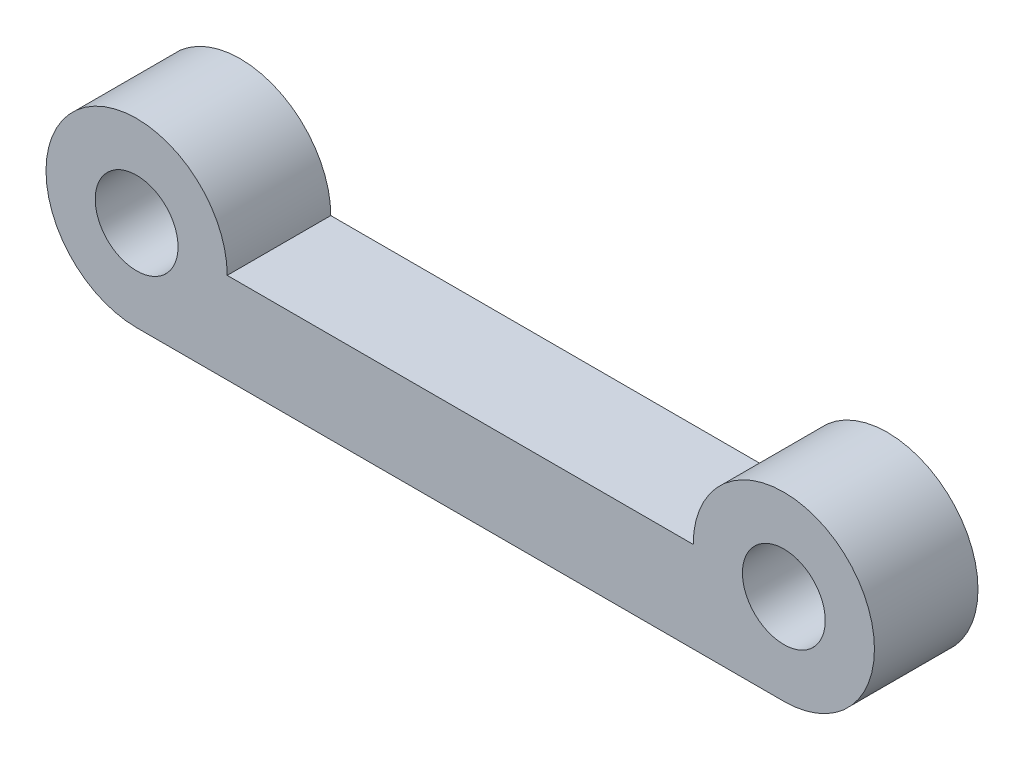
ISO-10303-21;
HEADER;
FILE_DESCRIPTION(('STEP AP214'),'2;1');
FILE_NAME('part.step','',(''),(''),'','','');
FILE_SCHEMA(('AUTOMOTIVE_DESIGN { 1 0 10303 214 1 1 1 1 }'));
ENDSEC;
DATA;
#1=APPLICATION_CONTEXT('core data for automotive mechanical design processes');
#2=APPLICATION_PROTOCOL_DEFINITION('international standard','automotive_design',2000,#1);
#3=PRODUCT_CONTEXT('',#1,'mechanical');
#4=PRODUCT('Part','Part','',(#3));
#5=PRODUCT_RELATED_PRODUCT_CATEGORY('part','',(#4));
#6=PRODUCT_DEFINITION_FORMATION('','',#4);
#7=PRODUCT_DEFINITION_CONTEXT('part definition',#1,'design');
#8=PRODUCT_DEFINITION('design','',#6,#7);
#9=PRODUCT_DEFINITION_SHAPE('','',#8);
#10=(LENGTH_UNIT() NAMED_UNIT(*) SI_UNIT(.MILLI.,.METRE.));
#11=(NAMED_UNIT(*) PLANE_ANGLE_UNIT() SI_UNIT($,.RADIAN.));
#12=(NAMED_UNIT(*) SI_UNIT($,.STERADIAN.) SOLID_ANGLE_UNIT());
#13=UNCERTAINTY_MEASURE_WITH_UNIT(LENGTH_MEASURE(1.E-05),#10,'distance_accuracy_value','');
#14=(GEOMETRIC_REPRESENTATION_CONTEXT(3) GLOBAL_UNCERTAINTY_ASSIGNED_CONTEXT((#13)) GLOBAL_UNIT_ASSIGNED_CONTEXT((#10,
#11,#12)) REPRESENTATION_CONTEXT('',''));
#15=CARTESIAN_POINT('',(0.,0.,0.));
#16=DIRECTION('',(0.,0.,1.));
#17=DIRECTION('',(1.,0.,0.));
#18=AXIS2_PLACEMENT_3D('',#15,#16,#17);
#19=CARTESIAN_POINT('',(0.,0.,4.));
#20=DIRECTION('',(0.,0.,1.));
#21=DIRECTION('',(1.,0.,0.));
#22=AXIS2_PLACEMENT_3D('',#19,#20,#21);
#23=PLANE('',#22);
#24=CARTESIAN_POINT('',(0.,0.,4.));
#25=DIRECTION('',(0.,0.,1.));
#26=DIRECTION('',(1.,0.,0.));
#27=AXIS2_PLACEMENT_3D('',#24,#25,#26);
#28=CIRCLE('',#27,1.6);
#29=CARTESIAN_POINT('',(1.6,0.,4.));
#30=VERTEX_POINT('',#29);
#31=EDGE_CURVE('E100',#30,#30,#28,.T.);
#32=ORIENTED_EDGE('',*,*,#31,.F.);
#33=EDGE_LOOP('',(#32));
#34=FACE_BOUND('',#33,.T.);
#35=CARTESIAN_POINT('',(0.,0.,4.));
#36=DIRECTION('',(0.,0.,1.));
#37=DIRECTION('',(1.,0.,0.));
#38=AXIS2_PLACEMENT_3D('',#35,#36,#37);
#39=CIRCLE('',#38,3.5);
#40=CARTESIAN_POINT('',(3.5,0.,4.));
#41=VERTEX_POINT('',#40);
#42=CARTESIAN_POINT('',(0.,-3.5,4.));
#43=VERTEX_POINT('',#42);
#44=EDGE_CURVE('E85',#41,#43,#39,.T.);
#45=ORIENTED_EDGE('',*,*,#44,.T.);
#46=DIRECTION('',(1.,0.,0.));
#47=VECTOR('',#46,1.);
#48=CARTESIAN_POINT('',(0.,-3.5,4.));
#49=LINE('',#48,#47);
#50=CARTESIAN_POINT('',(25.,-3.5,4.));
#51=VERTEX_POINT('',#50);
#52=EDGE_CURVE('E80',#43,#51,#49,.T.);
#53=ORIENTED_EDGE('',*,*,#52,.T.);
#54=CARTESIAN_POINT('',(25.,0.,4.));
#55=DIRECTION('',(0.,0.,1.));
#56=DIRECTION('',(1.,0.,0.));
#57=AXIS2_PLACEMENT_3D('',#54,#55,#56);
#58=CIRCLE('',#57,3.5);
#59=CARTESIAN_POINT('',(21.5,0.,4.));
#60=VERTEX_POINT('',#59);
#61=EDGE_CURVE('E83',#51,#60,#58,.T.);
#62=ORIENTED_EDGE('',*,*,#61,.T.);
#63=DIRECTION('',(-1.,0.,0.));
#64=VECTOR('',#63,1.);
#65=CARTESIAN_POINT('',(3.5,0.,4.));
#66=LINE('',#65,#64);
#67=EDGE_CURVE('E50',#60,#41,#66,.T.);
#68=ORIENTED_EDGE('',*,*,#67,.T.);
#69=EDGE_LOOP('',(#45,#53,#62,#68));
#70=FACE_BOUND('',#69,.T.);
#71=CARTESIAN_POINT('',(25.,0.,4.));
#72=DIRECTION('',(0.,0.,1.));
#73=DIRECTION('',(1.,0.,0.));
#74=AXIS2_PLACEMENT_3D('',#71,#72,#73);
#75=CIRCLE('',#74,1.6);
#76=CARTESIAN_POINT('',(26.6,0.,4.));
#77=VERTEX_POINT('',#76);
#78=EDGE_CURVE('E115',#77,#77,#75,.T.);
#79=ORIENTED_EDGE('',*,*,#78,.F.);
#80=EDGE_LOOP('',(#79));
#81=FACE_BOUND('',#80,.T.);
#82=ADVANCED_FACE('F33',(#34,#70,#81),#23,.T.);
#83=CARTESIAN_POINT('',(0.,0.,0.));
#84=DIRECTION('',(0.,0.,1.));
#85=DIRECTION('',(1.,0.,0.));
#86=AXIS2_PLACEMENT_3D('',#83,#84,#85);
#87=PLANE('',#86);
#88=CARTESIAN_POINT('',(0.,0.,0.));
#89=DIRECTION('',(0.,0.,1.));
#90=DIRECTION('',(1.,0.,0.));
#91=AXIS2_PLACEMENT_3D('',#88,#89,#90);
#92=CIRCLE('',#91,3.5);
#93=CARTESIAN_POINT('',(3.5,0.,0.));
#94=VERTEX_POINT('',#93);
#95=CARTESIAN_POINT('',(0.,-3.5,0.));
#96=VERTEX_POINT('',#95);
#97=EDGE_CURVE('E97',#94,#96,#92,.T.);
#98=ORIENTED_EDGE('',*,*,#97,.F.);
#99=DIRECTION('',(-1.,0.,0.));
#100=VECTOR('',#99,1.);
#101=CARTESIAN_POINT('',(3.5,0.,0.));
#102=LINE('',#101,#100);
#103=CARTESIAN_POINT('',(21.5,0.,0.));
#104=VERTEX_POINT('',#103);
#105=EDGE_CURVE('E73',#104,#94,#102,.T.);
#106=ORIENTED_EDGE('',*,*,#105,.F.);
#107=CARTESIAN_POINT('',(25.,0.,0.));
#108=DIRECTION('',(0.,0.,1.));
#109=DIRECTION('',(1.,0.,0.));
#110=AXIS2_PLACEMENT_3D('',#107,#108,#109);
#111=CIRCLE('',#110,3.5);
#112=CARTESIAN_POINT('',(25.,-3.5,0.));
#113=VERTEX_POINT('',#112);
#114=EDGE_CURVE('E67',#113,#104,#111,.T.);
#115=ORIENTED_EDGE('',*,*,#114,.F.);
#116=DIRECTION('',(1.,0.,0.));
#117=VECTOR('',#116,1.);
#118=CARTESIAN_POINT('',(0.,-3.5,0.));
#119=LINE('',#118,#117);
#120=EDGE_CURVE('E89',#96,#113,#119,.T.);
#121=ORIENTED_EDGE('',*,*,#120,.F.);
#122=EDGE_LOOP('',(#98,#106,#115,#121));
#123=FACE_BOUND('',#122,.T.);
#124=CARTESIAN_POINT('',(0.,0.,0.));
#125=DIRECTION('',(0.,0.,1.));
#126=DIRECTION('',(1.,0.,0.));
#127=AXIS2_PLACEMENT_3D('',#124,#125,#126);
#128=CIRCLE('',#127,1.6);
#129=CARTESIAN_POINT('',(1.6,0.,0.));
#130=VERTEX_POINT('',#129);
#131=EDGE_CURVE('E112',#130,#130,#128,.T.);
#132=ORIENTED_EDGE('',*,*,#131,.T.);
#133=EDGE_LOOP('',(#132));
#134=FACE_BOUND('',#133,.T.);
#135=CARTESIAN_POINT('',(25.,0.,0.));
#136=DIRECTION('',(0.,0.,1.));
#137=DIRECTION('',(1.,0.,0.));
#138=AXIS2_PLACEMENT_3D('',#135,#136,#137);
#139=CIRCLE('',#138,1.6);
#140=CARTESIAN_POINT('',(26.6,0.,0.));
#141=VERTEX_POINT('',#140);
#142=EDGE_CURVE('E118',#141,#141,#139,.T.);
#143=ORIENTED_EDGE('',*,*,#142,.T.);
#144=EDGE_LOOP('',(#143));
#145=FACE_BOUND('',#144,.T.);
#146=ADVANCED_FACE('F108',(#123,#134,#145),#87,.F.);
#147=CARTESIAN_POINT('',(0.,0.,4.));
#148=DIRECTION('',(0.,0.,-1.));
#149=DIRECTION('',(-1.,0.,0.));
#150=AXIS2_PLACEMENT_3D('',#147,#148,#149);
#151=CYLINDRICAL_SURFACE('',#150,3.5);
#152=ORIENTED_EDGE('',*,*,#97,.T.);
#153=DIRECTION('',(0.,0.,-1.));
#154=VECTOR('',#153,1.);
#155=CARTESIAN_POINT('',(0.,-3.5,4.));
#156=LINE('',#155,#154);
#157=EDGE_CURVE('E11',#43,#96,#156,.T.);
#158=ORIENTED_EDGE('',*,*,#157,.F.);
#159=ORIENTED_EDGE('',*,*,#44,.F.);
#160=DIRECTION('',(0.,0.,-1.));
#161=VECTOR('',#160,1.);
#162=CARTESIAN_POINT('',(3.5,0.,4.));
#163=LINE('',#162,#161);
#164=EDGE_CURVE('E93',#41,#94,#163,.T.);
#165=ORIENTED_EDGE('',*,*,#164,.T.);
#166=EDGE_LOOP('',(#152,#158,#159,#165));
#167=FACE_BOUND('',#166,.T.);
#168=ADVANCED_FACE('F35',(#167),#151,.T.);
#169=CARTESIAN_POINT('',(0.,-3.5,4.));
#170=DIRECTION('',(0.,1.,0.));
#171=DIRECTION('',(0.,0.,1.));
#172=AXIS2_PLACEMENT_3D('',#169,#170,#171);
#173=PLANE('',#172);
#174=ORIENTED_EDGE('',*,*,#120,.T.);
#175=DIRECTION('',(0.,0.,-1.));
#176=VECTOR('',#175,1.);
#177=CARTESIAN_POINT('',(25.,-3.5,4.));
#178=LINE('',#177,#176);
#179=EDGE_CURVE('E42',#51,#113,#178,.T.);
#180=ORIENTED_EDGE('',*,*,#179,.F.);
#181=ORIENTED_EDGE('',*,*,#52,.F.);
#182=ORIENTED_EDGE('',*,*,#157,.T.);
#183=EDGE_LOOP('',(#174,#180,#181,#182));
#184=FACE_BOUND('',#183,.T.);
#185=ADVANCED_FACE('F88',(#184),#173,.F.);
#186=CARTESIAN_POINT('',(25.,0.,4.));
#187=DIRECTION('',(0.,0.,-1.));
#188=DIRECTION('',(-1.,0.,0.));
#189=AXIS2_PLACEMENT_3D('',#186,#187,#188);
#190=CYLINDRICAL_SURFACE('',#189,3.5);
#191=ORIENTED_EDGE('',*,*,#114,.T.);
#192=DIRECTION('',(0.,0.,-1.));
#193=VECTOR('',#192,1.);
#194=CARTESIAN_POINT('',(21.5,0.,4.));
#195=LINE('',#194,#193);
#196=EDGE_CURVE('E90',#60,#104,#195,.T.);
#197=ORIENTED_EDGE('',*,*,#196,.F.);
#198=ORIENTED_EDGE('',*,*,#61,.F.);
#199=ORIENTED_EDGE('',*,*,#179,.T.);
#200=EDGE_LOOP('',(#191,#197,#198,#199));
#201=FACE_BOUND('',#200,.T.);
#202=ADVANCED_FACE('F91',(#201),#190,.T.);
#203=CARTESIAN_POINT('',(3.5,0.,4.));
#204=DIRECTION('',(0.,-1.,0.));
#205=DIRECTION('',(0.,0.,-1.));
#206=AXIS2_PLACEMENT_3D('',#203,#204,#205);
#207=PLANE('',#206);
#208=ORIENTED_EDGE('',*,*,#105,.T.);
#209=ORIENTED_EDGE('',*,*,#164,.F.);
#210=ORIENTED_EDGE('',*,*,#67,.F.);
#211=ORIENTED_EDGE('',*,*,#196,.T.);
#212=EDGE_LOOP('',(#208,#209,#210,#211));
#213=FACE_BOUND('',#212,.T.);
#214=ADVANCED_FACE('F105',(#213),#207,.F.);
#215=CARTESIAN_POINT('',(0.,0.,4.));
#216=DIRECTION('',(0.,0.,-1.));
#217=DIRECTION('',(-1.,0.,0.));
#218=AXIS2_PLACEMENT_3D('',#215,#216,#217);
#219=CYLINDRICAL_SURFACE('',#218,1.6);
#220=ORIENTED_EDGE('',*,*,#31,.T.);
#221=EDGE_LOOP('',(#220));
#222=FACE_BOUND('',#221,.T.);
#223=ORIENTED_EDGE('',*,*,#131,.F.);
#224=EDGE_LOOP('',(#223));
#225=FACE_BOUND('',#224,.T.);
#226=ADVANCED_FACE('F135',(#222,#225),#219,.F.);
#227=CARTESIAN_POINT('',(25.,0.,4.));
#228=DIRECTION('',(0.,0.,-1.));
#229=DIRECTION('',(-1.,0.,0.));
#230=AXIS2_PLACEMENT_3D('',#227,#228,#229);
#231=CYLINDRICAL_SURFACE('',#230,1.6);
#232=ORIENTED_EDGE('',*,*,#78,.T.);
#233=EDGE_LOOP('',(#232));
#234=FACE_BOUND('',#233,.T.);
#235=ORIENTED_EDGE('',*,*,#142,.F.);
#236=EDGE_LOOP('',(#235));
#237=FACE_BOUND('',#236,.T.);
#238=ADVANCED_FACE('F124',(#234,#237),#231,.F.);
#239=CLOSED_SHELL('',(#82,#146,#168,#185,#202,#214,#226,#238));
#240=MANIFOLD_SOLID_BREP('B2',#239);
#241=ADVANCED_BREP_SHAPE_REPRESENTATION('',(#18,#240),#14);
#242=SHAPE_DEFINITION_REPRESENTATION(#9,#241);
ENDSEC;
END-ISO-10303-21;
